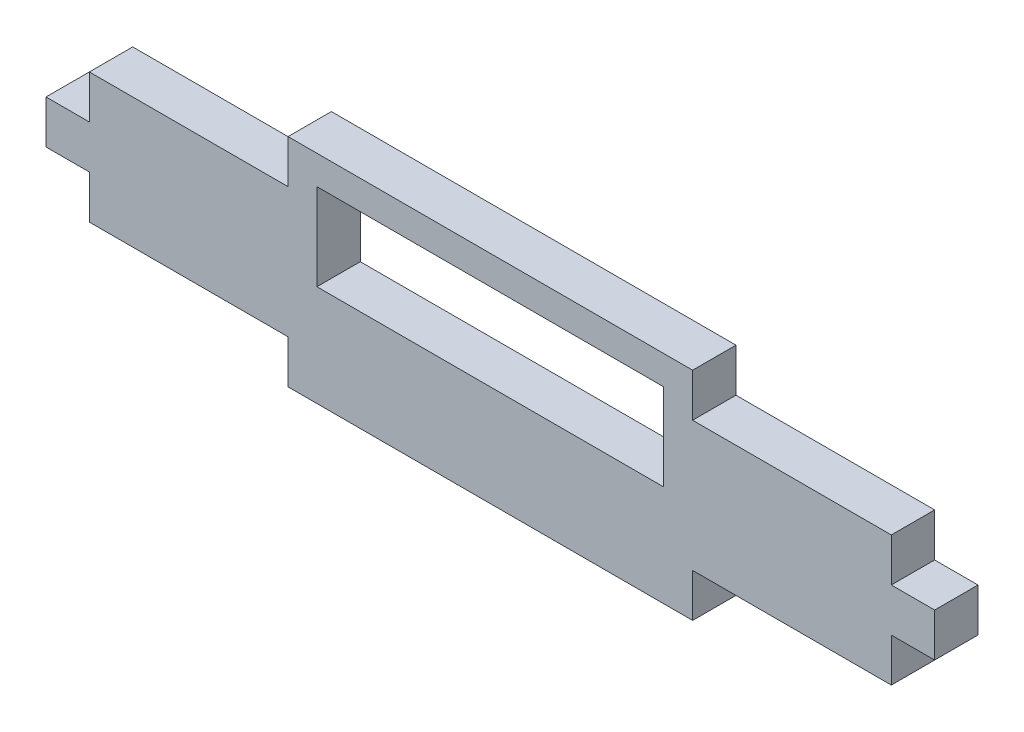
ISO-10303-21;
HEADER;
FILE_DESCRIPTION(('STEP AP214'),'2;1');
FILE_NAME('part.step','',(''),(''),'','','');
FILE_SCHEMA(('AUTOMOTIVE_DESIGN { 1 0 10303 214 1 1 1 1 }'));
ENDSEC;
DATA;
#1=APPLICATION_CONTEXT('core data for automotive mechanical design processes');
#2=APPLICATION_PROTOCOL_DEFINITION('international standard','automotive_design',2000,#1);
#3=PRODUCT_CONTEXT('',#1,'mechanical');
#4=PRODUCT('Part','Part','',(#3));
#5=PRODUCT_RELATED_PRODUCT_CATEGORY('part','',(#4));
#6=PRODUCT_DEFINITION_FORMATION('','',#4);
#7=PRODUCT_DEFINITION_CONTEXT('part definition',#1,'design');
#8=PRODUCT_DEFINITION('design','',#6,#7);
#9=PRODUCT_DEFINITION_SHAPE('','',#8);
#10=(LENGTH_UNIT() NAMED_UNIT(*) SI_UNIT(.MILLI.,.METRE.));
#11=(NAMED_UNIT(*) PLANE_ANGLE_UNIT() SI_UNIT($,.RADIAN.));
#12=(NAMED_UNIT(*) SI_UNIT($,.STERADIAN.) SOLID_ANGLE_UNIT());
#13=UNCERTAINTY_MEASURE_WITH_UNIT(LENGTH_MEASURE(1.E-05),#10,'distance_accuracy_value','');
#14=(GEOMETRIC_REPRESENTATION_CONTEXT(3) GLOBAL_UNCERTAINTY_ASSIGNED_CONTEXT((#13)) GLOBAL_UNIT_ASSIGNED_CONTEXT((#10,
#11,#12)) REPRESENTATION_CONTEXT('',''));
#15=CARTESIAN_POINT('',(0.,0.,0.));
#16=DIRECTION('',(0.,0.,1.));
#17=DIRECTION('',(1.,0.,0.));
#18=AXIS2_PLACEMENT_3D('',#15,#16,#17);
#19=CARTESIAN_POINT('',(0.,0.,3.));
#20=DIRECTION('',(0.,0.,1.));
#21=DIRECTION('',(1.,0.,0.));
#22=AXIS2_PLACEMENT_3D('',#19,#20,#21);
#23=PLANE('',#22);
#24=DIRECTION('',(0.,-1.,0.));
#25=VECTOR('',#24,1.);
#26=CARTESIAN_POINT('',(-14.,-7.5,3.));
#27=LINE('',#26,#25);
#28=CARTESIAN_POINT('',(-14.,-4.5,3.));
#29=VERTEX_POINT('',#28);
#30=CARTESIAN_POINT('',(-14.,-7.5,3.));
#31=VERTEX_POINT('',#30);
#32=EDGE_CURVE('E230',#29,#31,#27,.T.);
#33=ORIENTED_EDGE('',*,*,#32,.T.);
#34=DIRECTION('',(1.,0.,0.));
#35=VECTOR('',#34,1.);
#36=CARTESIAN_POINT('',(-14.,-7.5,3.));
#37=LINE('',#36,#35);
#38=CARTESIAN_POINT('',(14.,-7.5,3.));
#39=VERTEX_POINT('',#38);
#40=EDGE_CURVE('E233',#31,#39,#37,.T.);
#41=ORIENTED_EDGE('',*,*,#40,.T.);
#42=DIRECTION('',(0.,1.,0.));
#43=VECTOR('',#42,1.);
#44=CARTESIAN_POINT('',(14.,-4.5,3.));
#45=LINE('',#44,#43);
#46=CARTESIAN_POINT('',(14.,-4.5,3.));
#47=VERTEX_POINT('',#46);
#48=EDGE_CURVE('E236',#39,#47,#45,.T.);
#49=ORIENTED_EDGE('',*,*,#48,.T.);
#50=DIRECTION('',(1.,0.,0.));
#51=VECTOR('',#50,1.);
#52=CARTESIAN_POINT('',(27.75,-4.5,3.));
#53=LINE('',#52,#51);
#54=CARTESIAN_POINT('',(27.75,-4.5,3.));
#55=VERTEX_POINT('',#54);
#56=EDGE_CURVE('E238',#47,#55,#53,.T.);
#57=ORIENTED_EDGE('',*,*,#56,.T.);
#58=DIRECTION('',(0.,1.,0.));
#59=VECTOR('',#58,1.);
#60=CARTESIAN_POINT('',(27.75,-1.5,3.));
#61=LINE('',#60,#59);
#62=CARTESIAN_POINT('',(27.75,-1.5,3.));
#63=VERTEX_POINT('',#62);
#64=EDGE_CURVE('E240',#55,#63,#61,.T.);
#65=ORIENTED_EDGE('',*,*,#64,.T.);
#66=DIRECTION('',(1.,0.,0.));
#67=VECTOR('',#66,1.);
#68=CARTESIAN_POINT('',(30.75,-1.5,3.));
#69=LINE('',#68,#67);
#70=CARTESIAN_POINT('',(30.75,-1.5,3.));
#71=VERTEX_POINT('',#70);
#72=EDGE_CURVE('E242',#63,#71,#69,.T.);
#73=ORIENTED_EDGE('',*,*,#72,.T.);
#74=DIRECTION('',(0.,1.,0.));
#75=VECTOR('',#74,1.);
#76=CARTESIAN_POINT('',(30.75,-1.5,3.));
#77=LINE('',#76,#75);
#78=CARTESIAN_POINT('',(30.75,1.5,3.));
#79=VERTEX_POINT('',#78);
#80=EDGE_CURVE('E244',#71,#79,#77,.T.);
#81=ORIENTED_EDGE('',*,*,#80,.T.);
#82=DIRECTION('',(-1.,0.,0.));
#83=VECTOR('',#82,1.);
#84=CARTESIAN_POINT('',(30.75,1.5,3.));
#85=LINE('',#84,#83);
#86=CARTESIAN_POINT('',(27.75,1.5,3.));
#87=VERTEX_POINT('',#86);
#88=EDGE_CURVE('E246',#79,#87,#85,.T.);
#89=ORIENTED_EDGE('',*,*,#88,.T.);
#90=DIRECTION('',(0.,1.,0.));
#91=VECTOR('',#90,1.);
#92=CARTESIAN_POINT('',(27.75,1.5,3.));
#93=LINE('',#92,#91);
#94=CARTESIAN_POINT('',(27.75,4.5,3.));
#95=VERTEX_POINT('',#94);
#96=EDGE_CURVE('E248',#87,#95,#93,.T.);
#97=ORIENTED_EDGE('',*,*,#96,.T.);
#98=DIRECTION('',(-1.,0.,0.));
#99=VECTOR('',#98,1.);
#100=CARTESIAN_POINT('',(14.,4.5,3.));
#101=LINE('',#100,#99);
#102=CARTESIAN_POINT('',(14.,4.5,3.));
#103=VERTEX_POINT('',#102);
#104=EDGE_CURVE('E250',#95,#103,#101,.T.);
#105=ORIENTED_EDGE('',*,*,#104,.T.);
#106=DIRECTION('',(0.,1.,0.));
#107=VECTOR('',#106,1.);
#108=CARTESIAN_POINT('',(14.,7.5,3.));
#109=LINE('',#108,#107);
#110=CARTESIAN_POINT('',(14.,7.5,3.));
#111=VERTEX_POINT('',#110);
#112=EDGE_CURVE('E252',#103,#111,#109,.T.);
#113=ORIENTED_EDGE('',*,*,#112,.T.);
#114=DIRECTION('',(-1.,0.,0.));
#115=VECTOR('',#114,1.);
#116=CARTESIAN_POINT('',(14.,7.5,3.));
#117=LINE('',#116,#115);
#118=CARTESIAN_POINT('',(-14.,7.5,3.));
#119=VERTEX_POINT('',#118);
#120=EDGE_CURVE('E254',#111,#119,#117,.T.);
#121=ORIENTED_EDGE('',*,*,#120,.T.);
#122=DIRECTION('',(0.,-1.,0.));
#123=VECTOR('',#122,1.);
#124=CARTESIAN_POINT('',(-14.,7.5,3.));
#125=LINE('',#124,#123);
#126=CARTESIAN_POINT('',(-14.,4.5,3.));
#127=VERTEX_POINT('',#126);
#128=EDGE_CURVE('E256',#119,#127,#125,.T.);
#129=ORIENTED_EDGE('',*,*,#128,.T.);
#130=DIRECTION('',(-1.,0.,0.));
#131=VECTOR('',#130,1.);
#132=CARTESIAN_POINT('',(-27.75,4.5,3.));
#133=LINE('',#132,#131);
#134=CARTESIAN_POINT('',(-27.75,4.5,3.));
#135=VERTEX_POINT('',#134);
#136=EDGE_CURVE('E258',#127,#135,#133,.T.);
#137=ORIENTED_EDGE('',*,*,#136,.T.);
#138=DIRECTION('',(0.,-1.,0.));
#139=VECTOR('',#138,1.);
#140=CARTESIAN_POINT('',(-27.75,1.5,3.));
#141=LINE('',#140,#139);
#142=CARTESIAN_POINT('',(-27.75,1.5,3.));
#143=VERTEX_POINT('',#142);
#144=EDGE_CURVE('E260',#135,#143,#141,.T.);
#145=ORIENTED_EDGE('',*,*,#144,.T.);
#146=DIRECTION('',(-1.,0.,0.));
#147=VECTOR('',#146,1.);
#148=CARTESIAN_POINT('',(-30.75,1.5,3.));
#149=LINE('',#148,#147);
#150=CARTESIAN_POINT('',(-30.75,1.5,3.));
#151=VERTEX_POINT('',#150);
#152=EDGE_CURVE('E262',#143,#151,#149,.T.);
#153=ORIENTED_EDGE('',*,*,#152,.T.);
#154=DIRECTION('',(0.,-1.,0.));
#155=VECTOR('',#154,1.);
#156=CARTESIAN_POINT('',(-30.75,1.5,3.));
#157=LINE('',#156,#155);
#158=CARTESIAN_POINT('',(-30.75,-1.5,3.));
#159=VERTEX_POINT('',#158);
#160=EDGE_CURVE('E264',#151,#159,#157,.T.);
#161=ORIENTED_EDGE('',*,*,#160,.T.);
#162=DIRECTION('',(1.,0.,0.));
#163=VECTOR('',#162,1.);
#164=CARTESIAN_POINT('',(-30.75,-1.5,3.));
#165=LINE('',#164,#163);
#166=CARTESIAN_POINT('',(-27.75,-1.5,3.));
#167=VERTEX_POINT('',#166);
#168=EDGE_CURVE('E266',#159,#167,#165,.T.);
#169=ORIENTED_EDGE('',*,*,#168,.T.);
#170=DIRECTION('',(0.,-1.,0.));
#171=VECTOR('',#170,1.);
#172=CARTESIAN_POINT('',(-27.75,-1.5,3.));
#173=LINE('',#172,#171);
#174=CARTESIAN_POINT('',(-27.75,-4.5,3.));
#175=VERTEX_POINT('',#174);
#176=EDGE_CURVE('E268',#167,#175,#173,.T.);
#177=ORIENTED_EDGE('',*,*,#176,.T.);
#178=DIRECTION('',(1.,0.,0.));
#179=VECTOR('',#178,1.);
#180=CARTESIAN_POINT('',(-14.,-4.5,3.));
#181=LINE('',#180,#179);
#182=EDGE_CURVE('E270',#175,#29,#181,.T.);
#183=ORIENTED_EDGE('',*,*,#182,.T.);
#184=EDGE_LOOP('',(#33,#41,#49,#57,#65,#73,#81,#89,#97,#105,#113,#121,#129,#137,#145,#153,#161,
#169,#177,#183));
#185=FACE_BOUND('',#184,.T.);
#186=DIRECTION('',(-1.,0.,0.));
#187=VECTOR('',#186,1.);
#188=CARTESIAN_POINT('',(-12.,5.5,3.));
#189=LINE('',#188,#187);
#190=CARTESIAN_POINT('',(12.,5.5,3.));
#191=VERTEX_POINT('',#190);
#192=CARTESIAN_POINT('',(-12.,5.5,3.));
#193=VERTEX_POINT('',#192);
#194=EDGE_CURVE('E202',#191,#193,#189,.T.);
#195=ORIENTED_EDGE('',*,*,#194,.F.);
#196=DIRECTION('',(0.,1.,0.));
#197=VECTOR('',#196,1.);
#198=CARTESIAN_POINT('',(12.,-0.5,3.));
#199=LINE('',#198,#197);
#200=CARTESIAN_POINT('',(12.,-0.5,3.));
#201=VERTEX_POINT('',#200);
#202=EDGE_CURVE('E194',#201,#191,#199,.T.);
#203=ORIENTED_EDGE('',*,*,#202,.F.);
#204=DIRECTION('',(1.,0.,0.));
#205=VECTOR('',#204,1.);
#206=CARTESIAN_POINT('',(-12.,-0.5,3.));
#207=LINE('',#206,#205);
#208=CARTESIAN_POINT('',(-12.,-0.5,3.));
#209=VERTEX_POINT('',#208);
#210=EDGE_CURVE('E216',#209,#201,#207,.T.);
#211=ORIENTED_EDGE('',*,*,#210,.F.);
#212=DIRECTION('',(0.,-1.,0.));
#213=VECTOR('',#212,1.);
#214=CARTESIAN_POINT('',(-12.,-0.5,3.));
#215=LINE('',#214,#213);
#216=EDGE_CURVE('E214',#193,#209,#215,.T.);
#217=ORIENTED_EDGE('',*,*,#216,.F.);
#218=EDGE_LOOP('',(#195,#203,#211,#217));
#219=FACE_BOUND('',#218,.T.);
#220=ADVANCED_FACE('F33',(#185,#219),#23,.T.);
#221=CARTESIAN_POINT('',(0.,0.,0.));
#222=DIRECTION('',(0.,0.,1.));
#223=DIRECTION('',(1.,0.,0.));
#224=AXIS2_PLACEMENT_3D('',#221,#222,#223);
#225=PLANE('',#224);
#226=DIRECTION('',(0.,-1.,0.));
#227=VECTOR('',#226,1.);
#228=CARTESIAN_POINT('',(-14.,-7.5,0.));
#229=LINE('',#228,#227);
#230=CARTESIAN_POINT('',(-14.,-4.5,0.));
#231=VERTEX_POINT('',#230);
#232=CARTESIAN_POINT('',(-14.,-7.5,0.));
#233=VERTEX_POINT('',#232);
#234=EDGE_CURVE('E210',#231,#233,#229,.T.);
#235=ORIENTED_EDGE('',*,*,#234,.F.);
#236=DIRECTION('',(1.,0.,0.));
#237=VECTOR('',#236,1.);
#238=CARTESIAN_POINT('',(-14.,-4.5,0.));
#239=LINE('',#238,#237);
#240=CARTESIAN_POINT('',(-27.75,-4.5,0.));
#241=VERTEX_POINT('',#240);
#242=EDGE_CURVE('E234',#241,#231,#239,.T.);
#243=ORIENTED_EDGE('',*,*,#242,.F.);
#244=DIRECTION('',(0.,-1.,0.));
#245=VECTOR('',#244,1.);
#246=CARTESIAN_POINT('',(-27.75,-1.5,0.));
#247=LINE('',#246,#245);
#248=CARTESIAN_POINT('',(-27.75,-1.5,0.));
#249=VERTEX_POINT('',#248);
#250=EDGE_CURVE('E309',#249,#241,#247,.T.);
#251=ORIENTED_EDGE('',*,*,#250,.F.);
#252=DIRECTION('',(1.,0.,0.));
#253=VECTOR('',#252,1.);
#254=CARTESIAN_POINT('',(-30.75,-1.5,0.));
#255=LINE('',#254,#253);
#256=CARTESIAN_POINT('',(-30.75,-1.5,0.));
#257=VERTEX_POINT('',#256);
#258=EDGE_CURVE('E307',#257,#249,#255,.T.);
#259=ORIENTED_EDGE('',*,*,#258,.F.);
#260=DIRECTION('',(0.,-1.,0.));
#261=VECTOR('',#260,1.);
#262=CARTESIAN_POINT('',(-30.75,1.5,0.));
#263=LINE('',#262,#261);
#264=CARTESIAN_POINT('',(-30.75,1.5,0.));
#265=VERTEX_POINT('',#264);
#266=EDGE_CURVE('E305',#265,#257,#263,.T.);
#267=ORIENTED_EDGE('',*,*,#266,.F.);
#268=DIRECTION('',(-1.,0.,0.));
#269=VECTOR('',#268,1.);
#270=CARTESIAN_POINT('',(-30.75,1.5,0.));
#271=LINE('',#270,#269);
#272=CARTESIAN_POINT('',(-27.75,1.5,0.));
#273=VERTEX_POINT('',#272);
#274=EDGE_CURVE('E303',#273,#265,#271,.T.);
#275=ORIENTED_EDGE('',*,*,#274,.F.);
#276=DIRECTION('',(0.,-1.,0.));
#277=VECTOR('',#276,1.);
#278=CARTESIAN_POINT('',(-27.75,1.5,0.));
#279=LINE('',#278,#277);
#280=CARTESIAN_POINT('',(-27.75,4.5,0.));
#281=VERTEX_POINT('',#280);
#282=EDGE_CURVE('E301',#281,#273,#279,.T.);
#283=ORIENTED_EDGE('',*,*,#282,.F.);
#284=DIRECTION('',(-1.,0.,0.));
#285=VECTOR('',#284,1.);
#286=CARTESIAN_POINT('',(-27.75,4.5,0.));
#287=LINE('',#286,#285);
#288=CARTESIAN_POINT('',(-14.,4.5,0.));
#289=VERTEX_POINT('',#288);
#290=EDGE_CURVE('E299',#289,#281,#287,.T.);
#291=ORIENTED_EDGE('',*,*,#290,.F.);
#292=DIRECTION('',(0.,-1.,0.));
#293=VECTOR('',#292,1.);
#294=CARTESIAN_POINT('',(-14.,7.5,0.));
#295=LINE('',#294,#293);
#296=CARTESIAN_POINT('',(-14.,7.5,0.));
#297=VERTEX_POINT('',#296);
#298=EDGE_CURVE('E297',#297,#289,#295,.T.);
#299=ORIENTED_EDGE('',*,*,#298,.F.);
#300=DIRECTION('',(-1.,0.,0.));
#301=VECTOR('',#300,1.);
#302=CARTESIAN_POINT('',(14.,7.5,0.));
#303=LINE('',#302,#301);
#304=CARTESIAN_POINT('',(14.,7.5,0.));
#305=VERTEX_POINT('',#304);
#306=EDGE_CURVE('E295',#305,#297,#303,.T.);
#307=ORIENTED_EDGE('',*,*,#306,.F.);
#308=DIRECTION('',(0.,1.,0.));
#309=VECTOR('',#308,1.);
#310=CARTESIAN_POINT('',(14.,7.5,0.));
#311=LINE('',#310,#309);
#312=CARTESIAN_POINT('',(14.,4.5,0.));
#313=VERTEX_POINT('',#312);
#314=EDGE_CURVE('E293',#313,#305,#311,.T.);
#315=ORIENTED_EDGE('',*,*,#314,.F.);
#316=DIRECTION('',(-1.,0.,0.));
#317=VECTOR('',#316,1.);
#318=CARTESIAN_POINT('',(14.,4.5,0.));
#319=LINE('',#318,#317);
#320=CARTESIAN_POINT('',(27.75,4.5,0.));
#321=VERTEX_POINT('',#320);
#322=EDGE_CURVE('E291',#321,#313,#319,.T.);
#323=ORIENTED_EDGE('',*,*,#322,.F.);
#324=DIRECTION('',(0.,1.,0.));
#325=VECTOR('',#324,1.);
#326=CARTESIAN_POINT('',(27.75,1.5,0.));
#327=LINE('',#326,#325);
#328=CARTESIAN_POINT('',(27.75,1.5,0.));
#329=VERTEX_POINT('',#328);
#330=EDGE_CURVE('E289',#329,#321,#327,.T.);
#331=ORIENTED_EDGE('',*,*,#330,.F.);
#332=DIRECTION('',(-1.,0.,0.));
#333=VECTOR('',#332,1.);
#334=CARTESIAN_POINT('',(30.75,1.5,0.));
#335=LINE('',#334,#333);
#336=CARTESIAN_POINT('',(30.75,1.5,0.));
#337=VERTEX_POINT('',#336);
#338=EDGE_CURVE('E287',#337,#329,#335,.T.);
#339=ORIENTED_EDGE('',*,*,#338,.F.);
#340=DIRECTION('',(0.,1.,0.));
#341=VECTOR('',#340,1.);
#342=CARTESIAN_POINT('',(30.75,-1.5,0.));
#343=LINE('',#342,#341);
#344=CARTESIAN_POINT('',(30.75,-1.5,0.));
#345=VERTEX_POINT('',#344);
#346=EDGE_CURVE('E285',#345,#337,#343,.T.);
#347=ORIENTED_EDGE('',*,*,#346,.F.);
#348=DIRECTION('',(1.,0.,0.));
#349=VECTOR('',#348,1.);
#350=CARTESIAN_POINT('',(30.75,-1.5,0.));
#351=LINE('',#350,#349);
#352=CARTESIAN_POINT('',(27.75,-1.5,0.));
#353=VERTEX_POINT('',#352);
#354=EDGE_CURVE('E283',#353,#345,#351,.T.);
#355=ORIENTED_EDGE('',*,*,#354,.F.);
#356=DIRECTION('',(0.,1.,0.));
#357=VECTOR('',#356,1.);
#358=CARTESIAN_POINT('',(27.75,-1.5,0.));
#359=LINE('',#358,#357);
#360=CARTESIAN_POINT('',(27.75,-4.5,0.));
#361=VERTEX_POINT('',#360);
#362=EDGE_CURVE('E281',#361,#353,#359,.T.);
#363=ORIENTED_EDGE('',*,*,#362,.F.);
#364=DIRECTION('',(1.,0.,0.));
#365=VECTOR('',#364,1.);
#366=CARTESIAN_POINT('',(27.75,-4.5,0.));
#367=LINE('',#366,#365);
#368=CARTESIAN_POINT('',(14.,-4.5,0.));
#369=VERTEX_POINT('',#368);
#370=EDGE_CURVE('E279',#369,#361,#367,.T.);
#371=ORIENTED_EDGE('',*,*,#370,.F.);
#372=DIRECTION('',(0.,1.,0.));
#373=VECTOR('',#372,1.);
#374=CARTESIAN_POINT('',(14.,-4.5,0.));
#375=LINE('',#374,#373);
#376=CARTESIAN_POINT('',(14.,-7.5,0.));
#377=VERTEX_POINT('',#376);
#378=EDGE_CURVE('E277',#377,#369,#375,.T.);
#379=ORIENTED_EDGE('',*,*,#378,.F.);
#380=DIRECTION('',(1.,0.,0.));
#381=VECTOR('',#380,1.);
#382=CARTESIAN_POINT('',(-14.,-7.5,0.));
#383=LINE('',#382,#381);
#384=EDGE_CURVE('E275',#233,#377,#383,.T.);
#385=ORIENTED_EDGE('',*,*,#384,.F.);
#386=EDGE_LOOP('',(#235,#243,#251,#259,#267,#275,#283,#291,#299,#307,#315,#323,#331,#339,#347,
#355,#363,#371,#379,#385));
#387=FACE_BOUND('',#386,.T.);
#388=DIRECTION('',(0.,1.,0.));
#389=VECTOR('',#388,1.);
#390=CARTESIAN_POINT('',(12.,-0.5,0.));
#391=LINE('',#390,#389);
#392=CARTESIAN_POINT('',(12.,-0.5,0.));
#393=VERTEX_POINT('',#392);
#394=CARTESIAN_POINT('',(12.,5.5,0.));
#395=VERTEX_POINT('',#394);
#396=EDGE_CURVE('E56',#393,#395,#391,.T.);
#397=ORIENTED_EDGE('',*,*,#396,.T.);
#398=DIRECTION('',(-1.,0.,0.));
#399=VECTOR('',#398,1.);
#400=CARTESIAN_POINT('',(-12.,5.5,0.));
#401=LINE('',#400,#399);
#402=CARTESIAN_POINT('',(-12.,5.5,0.));
#403=VERTEX_POINT('',#402);
#404=EDGE_CURVE('E209',#395,#403,#401,.T.);
#405=ORIENTED_EDGE('',*,*,#404,.T.);
#406=DIRECTION('',(0.,-1.,0.));
#407=VECTOR('',#406,1.);
#408=CARTESIAN_POINT('',(-12.,-0.5,0.));
#409=LINE('',#408,#407);
#410=CARTESIAN_POINT('',(-12.,-0.5,0.));
#411=VERTEX_POINT('',#410);
#412=EDGE_CURVE('E222',#403,#411,#409,.T.);
#413=ORIENTED_EDGE('',*,*,#412,.T.);
#414=DIRECTION('',(1.,0.,0.));
#415=VECTOR('',#414,1.);
#416=CARTESIAN_POINT('',(-12.,-0.5,0.));
#417=LINE('',#416,#415);
#418=EDGE_CURVE('E203',#411,#393,#417,.T.);
#419=ORIENTED_EDGE('',*,*,#418,.T.);
#420=EDGE_LOOP('',(#397,#405,#413,#419));
#421=FACE_BOUND('',#420,.T.);
#422=ADVANCED_FACE('F375',(#387,#421),#225,.F.);
#423=CARTESIAN_POINT('',(-14.,-7.5,3.));
#424=DIRECTION('',(1.,0.,0.));
#425=DIRECTION('',(0.,0.,-1.));
#426=AXIS2_PLACEMENT_3D('',#423,#424,#425);
#427=PLANE('',#426);
#428=ORIENTED_EDGE('',*,*,#234,.T.);
#429=DIRECTION('',(0.,0.,-1.));
#430=VECTOR('',#429,1.);
#431=CARTESIAN_POINT('',(-14.,-7.5,3.));
#432=LINE('',#431,#430);
#433=EDGE_CURVE('E11',#31,#233,#432,.T.);
#434=ORIENTED_EDGE('',*,*,#433,.F.);
#435=ORIENTED_EDGE('',*,*,#32,.F.);
#436=DIRECTION('',(0.,0.,-1.));
#437=VECTOR('',#436,1.);
#438=CARTESIAN_POINT('',(-14.,-4.5,3.));
#439=LINE('',#438,#437);
#440=EDGE_CURVE('E272',#29,#231,#439,.T.);
#441=ORIENTED_EDGE('',*,*,#440,.T.);
#442=EDGE_LOOP('',(#428,#434,#435,#441));
#443=FACE_BOUND('',#442,.T.);
#444=ADVANCED_FACE('F35',(#443),#427,.F.);
#445=CARTESIAN_POINT('',(-14.,-7.5,3.));
#446=DIRECTION('',(0.,1.,0.));
#447=DIRECTION('',(0.,0.,1.));
#448=AXIS2_PLACEMENT_3D('',#445,#446,#447);
#449=PLANE('',#448);
#450=ORIENTED_EDGE('',*,*,#384,.T.);
#451=DIRECTION('',(0.,0.,-1.));
#452=VECTOR('',#451,1.);
#453=CARTESIAN_POINT('',(14.,-7.5,3.));
#454=LINE('',#453,#452);
#455=EDGE_CURVE('E41',#39,#377,#454,.T.);
#456=ORIENTED_EDGE('',*,*,#455,.F.);
#457=ORIENTED_EDGE('',*,*,#40,.F.);
#458=ORIENTED_EDGE('',*,*,#433,.T.);
#459=EDGE_LOOP('',(#450,#456,#457,#458));
#460=FACE_BOUND('',#459,.T.);
#461=ADVANCED_FACE('F392',(#460),#449,.F.);
#462=CARTESIAN_POINT('',(14.,-4.5,3.));
#463=DIRECTION('',(-1.,0.,0.));
#464=DIRECTION('',(0.,0.,1.));
#465=AXIS2_PLACEMENT_3D('',#462,#463,#464);
#466=PLANE('',#465);
#467=ORIENTED_EDGE('',*,*,#378,.T.);
#468=DIRECTION('',(0.,0.,-1.));
#469=VECTOR('',#468,1.);
#470=CARTESIAN_POINT('',(14.,-4.5,3.));
#471=LINE('',#470,#469);
#472=EDGE_CURVE('E362',#47,#369,#471,.T.);
#473=ORIENTED_EDGE('',*,*,#472,.F.);
#474=ORIENTED_EDGE('',*,*,#48,.F.);
#475=ORIENTED_EDGE('',*,*,#455,.T.);
#476=EDGE_LOOP('',(#467,#473,#474,#475));
#477=FACE_BOUND('',#476,.T.);
#478=ADVANCED_FACE('F369',(#477),#466,.F.);
#479=CARTESIAN_POINT('',(27.75,-4.5,3.));
#480=DIRECTION('',(0.,1.,0.));
#481=DIRECTION('',(-1.,0.,0.));
#482=AXIS2_PLACEMENT_3D('',#479,#480,#481);
#483=PLANE('',#482);
#484=ORIENTED_EDGE('',*,*,#370,.T.);
#485=DIRECTION('',(0.,0.,-1.));
#486=VECTOR('',#485,1.);
#487=CARTESIAN_POINT('',(27.75,-4.5,3.));
#488=LINE('',#487,#486);
#489=EDGE_CURVE('E359',#55,#361,#488,.T.);
#490=ORIENTED_EDGE('',*,*,#489,.F.);
#491=ORIENTED_EDGE('',*,*,#56,.F.);
#492=ORIENTED_EDGE('',*,*,#472,.T.);
#493=EDGE_LOOP('',(#484,#490,#491,#492));
#494=FACE_BOUND('',#493,.T.);
#495=ADVANCED_FACE('F381',(#494),#483,.F.);
#496=CARTESIAN_POINT('',(27.75,-1.5,3.));
#497=DIRECTION('',(-1.,0.,0.));
#498=DIRECTION('',(0.,0.,1.));
#499=AXIS2_PLACEMENT_3D('',#496,#497,#498);
#500=PLANE('',#499);
#501=ORIENTED_EDGE('',*,*,#362,.T.);
#502=DIRECTION('',(0.,0.,-1.));
#503=VECTOR('',#502,1.);
#504=CARTESIAN_POINT('',(27.75,-1.5,3.));
#505=LINE('',#504,#503);
#506=EDGE_CURVE('E356',#63,#353,#505,.T.);
#507=ORIENTED_EDGE('',*,*,#506,.F.);
#508=ORIENTED_EDGE('',*,*,#64,.F.);
#509=ORIENTED_EDGE('',*,*,#489,.T.);
#510=EDGE_LOOP('',(#501,#507,#508,#509));
#511=FACE_BOUND('',#510,.T.);
#512=ADVANCED_FACE('F385',(#511),#500,.F.);
#513=CARTESIAN_POINT('',(30.75,-1.5,3.));
#514=DIRECTION('',(0.,1.,0.));
#515=DIRECTION('',(-1.,0.,0.));
#516=AXIS2_PLACEMENT_3D('',#513,#514,#515);
#517=PLANE('',#516);
#518=ORIENTED_EDGE('',*,*,#354,.T.);
#519=DIRECTION('',(0.,0.,-1.));
#520=VECTOR('',#519,1.);
#521=CARTESIAN_POINT('',(30.75,-1.5,3.));
#522=LINE('',#521,#520);
#523=EDGE_CURVE('E353',#71,#345,#522,.T.);
#524=ORIENTED_EDGE('',*,*,#523,.F.);
#525=ORIENTED_EDGE('',*,*,#72,.F.);
#526=ORIENTED_EDGE('',*,*,#506,.T.);
#527=EDGE_LOOP('',(#518,#524,#525,#526));
#528=FACE_BOUND('',#527,.T.);
#529=ADVANCED_FACE('F465',(#528),#517,.F.);
#530=CARTESIAN_POINT('',(30.75,-1.5,3.));
#531=DIRECTION('',(-1.,0.,0.));
#532=DIRECTION('',(0.,0.,1.));
#533=AXIS2_PLACEMENT_3D('',#530,#531,#532);
#534=PLANE('',#533);
#535=ORIENTED_EDGE('',*,*,#346,.T.);
#536=DIRECTION('',(0.,0.,-1.));
#537=VECTOR('',#536,1.);
#538=CARTESIAN_POINT('',(30.75,1.5,3.));
#539=LINE('',#538,#537);
#540=EDGE_CURVE('E350',#79,#337,#539,.T.);
#541=ORIENTED_EDGE('',*,*,#540,.F.);
#542=ORIENTED_EDGE('',*,*,#80,.F.);
#543=ORIENTED_EDGE('',*,*,#523,.T.);
#544=EDGE_LOOP('',(#535,#541,#542,#543));
#545=FACE_BOUND('',#544,.T.);
#546=ADVANCED_FACE('F463',(#545),#534,.F.);
#547=CARTESIAN_POINT('',(30.75,1.5,3.));
#548=DIRECTION('',(0.,-1.,0.));
#549=DIRECTION('',(1.,0.,0.));
#550=AXIS2_PLACEMENT_3D('',#547,#548,#549);
#551=PLANE('',#550);
#552=ORIENTED_EDGE('',*,*,#338,.T.);
#553=DIRECTION('',(0.,0.,-1.));
#554=VECTOR('',#553,1.);
#555=CARTESIAN_POINT('',(27.75,1.5,3.));
#556=LINE('',#555,#554);
#557=EDGE_CURVE('E347',#87,#329,#556,.T.);
#558=ORIENTED_EDGE('',*,*,#557,.F.);
#559=ORIENTED_EDGE('',*,*,#88,.F.);
#560=ORIENTED_EDGE('',*,*,#540,.T.);
#561=EDGE_LOOP('',(#552,#558,#559,#560));
#562=FACE_BOUND('',#561,.T.);
#563=ADVANCED_FACE('F458',(#562),#551,.F.);
#564=CARTESIAN_POINT('',(27.75,1.5,3.));
#565=DIRECTION('',(-1.,0.,0.));
#566=DIRECTION('',(0.,0.,1.));
#567=AXIS2_PLACEMENT_3D('',#564,#565,#566);
#568=PLANE('',#567);
#569=ORIENTED_EDGE('',*,*,#330,.T.);
#570=DIRECTION('',(0.,0.,-1.));
#571=VECTOR('',#570,1.);
#572=CARTESIAN_POINT('',(27.75,4.5,3.));
#573=LINE('',#572,#571);
#574=EDGE_CURVE('E344',#95,#321,#573,.T.);
#575=ORIENTED_EDGE('',*,*,#574,.F.);
#576=ORIENTED_EDGE('',*,*,#96,.F.);
#577=ORIENTED_EDGE('',*,*,#557,.T.);
#578=EDGE_LOOP('',(#569,#575,#576,#577));
#579=FACE_BOUND('',#578,.T.);
#580=ADVANCED_FACE('F453',(#579),#568,.F.);
#581=CARTESIAN_POINT('',(14.,4.5,3.));
#582=DIRECTION('',(0.,-1.,0.));
#583=DIRECTION('',(1.,0.,0.));
#584=AXIS2_PLACEMENT_3D('',#581,#582,#583);
#585=PLANE('',#584);
#586=ORIENTED_EDGE('',*,*,#322,.T.);
#587=DIRECTION('',(0.,0.,-1.));
#588=VECTOR('',#587,1.);
#589=CARTESIAN_POINT('',(14.,4.5,3.));
#590=LINE('',#589,#588);
#591=EDGE_CURVE('E341',#103,#313,#590,.T.);
#592=ORIENTED_EDGE('',*,*,#591,.F.);
#593=ORIENTED_EDGE('',*,*,#104,.F.);
#594=ORIENTED_EDGE('',*,*,#574,.T.);
#595=EDGE_LOOP('',(#586,#592,#593,#594));
#596=FACE_BOUND('',#595,.T.);
#597=ADVANCED_FACE('F449',(#596),#585,.F.);
#598=CARTESIAN_POINT('',(14.,7.5,3.));
#599=DIRECTION('',(-1.,0.,0.));
#600=DIRECTION('',(0.,0.,1.));
#601=AXIS2_PLACEMENT_3D('',#598,#599,#600);
#602=PLANE('',#601);
#603=ORIENTED_EDGE('',*,*,#314,.T.);
#604=DIRECTION('',(0.,0.,-1.));
#605=VECTOR('',#604,1.);
#606=CARTESIAN_POINT('',(14.,7.5,3.));
#607=LINE('',#606,#605);
#608=EDGE_CURVE('E338',#111,#305,#607,.T.);
#609=ORIENTED_EDGE('',*,*,#608,.F.);
#610=ORIENTED_EDGE('',*,*,#112,.F.);
#611=ORIENTED_EDGE('',*,*,#591,.T.);
#612=EDGE_LOOP('',(#603,#609,#610,#611));
#613=FACE_BOUND('',#612,.T.);
#614=ADVANCED_FACE('F444',(#613),#602,.F.);
#615=CARTESIAN_POINT('',(14.,7.5,3.));
#616=DIRECTION('',(0.,-1.,0.));
#617=DIRECTION('',(0.,0.,-1.));
#618=AXIS2_PLACEMENT_3D('',#615,#616,#617);
#619=PLANE('',#618);
#620=ORIENTED_EDGE('',*,*,#306,.T.);
#621=DIRECTION('',(0.,0.,-1.));
#622=VECTOR('',#621,1.);
#623=CARTESIAN_POINT('',(-14.,7.5,3.));
#624=LINE('',#623,#622);
#625=EDGE_CURVE('E335',#119,#297,#624,.T.);
#626=ORIENTED_EDGE('',*,*,#625,.F.);
#627=ORIENTED_EDGE('',*,*,#120,.F.);
#628=ORIENTED_EDGE('',*,*,#608,.T.);
#629=EDGE_LOOP('',(#620,#626,#627,#628));
#630=FACE_BOUND('',#629,.T.);
#631=ADVANCED_FACE('F438',(#630),#619,.F.);
#632=CARTESIAN_POINT('',(-14.,7.5,3.));
#633=DIRECTION('',(1.,0.,0.));
#634=DIRECTION('',(0.,0.,-1.));
#635=AXIS2_PLACEMENT_3D('',#632,#633,#634);
#636=PLANE('',#635);
#637=ORIENTED_EDGE('',*,*,#298,.T.);
#638=DIRECTION('',(0.,0.,-1.));
#639=VECTOR('',#638,1.);
#640=CARTESIAN_POINT('',(-14.,4.5,3.));
#641=LINE('',#640,#639);
#642=EDGE_CURVE('E332',#127,#289,#641,.T.);
#643=ORIENTED_EDGE('',*,*,#642,.F.);
#644=ORIENTED_EDGE('',*,*,#128,.F.);
#645=ORIENTED_EDGE('',*,*,#625,.T.);
#646=EDGE_LOOP('',(#637,#643,#644,#645));
#647=FACE_BOUND('',#646,.T.);
#648=ADVANCED_FACE('F434',(#647),#636,.F.);
#649=CARTESIAN_POINT('',(-27.75,4.5,3.));
#650=DIRECTION('',(0.,-1.,0.));
#651=DIRECTION('',(1.,0.,0.));
#652=AXIS2_PLACEMENT_3D('',#649,#650,#651);
#653=PLANE('',#652);
#654=ORIENTED_EDGE('',*,*,#290,.T.);
#655=DIRECTION('',(0.,0.,-1.));
#656=VECTOR('',#655,1.);
#657=CARTESIAN_POINT('',(-27.75,4.5,3.));
#658=LINE('',#657,#656);
#659=EDGE_CURVE('E329',#135,#281,#658,.T.);
#660=ORIENTED_EDGE('',*,*,#659,.F.);
#661=ORIENTED_EDGE('',*,*,#136,.F.);
#662=ORIENTED_EDGE('',*,*,#642,.T.);
#663=EDGE_LOOP('',(#654,#660,#661,#662));
#664=FACE_BOUND('',#663,.T.);
#665=ADVANCED_FACE('F429',(#664),#653,.F.);
#666=CARTESIAN_POINT('',(-27.75,1.5,3.));
#667=DIRECTION('',(1.,0.,0.));
#668=DIRECTION('',(0.,0.,-1.));
#669=AXIS2_PLACEMENT_3D('',#666,#667,#668);
#670=PLANE('',#669);
#671=ORIENTED_EDGE('',*,*,#282,.T.);
#672=DIRECTION('',(0.,0.,-1.));
#673=VECTOR('',#672,1.);
#674=CARTESIAN_POINT('',(-27.75,1.5,3.));
#675=LINE('',#674,#673);
#676=EDGE_CURVE('E326',#143,#273,#675,.T.);
#677=ORIENTED_EDGE('',*,*,#676,.F.);
#678=ORIENTED_EDGE('',*,*,#144,.F.);
#679=ORIENTED_EDGE('',*,*,#659,.T.);
#680=EDGE_LOOP('',(#671,#677,#678,#679));
#681=FACE_BOUND('',#680,.T.);
#682=ADVANCED_FACE('F423',(#681),#670,.F.);
#683=CARTESIAN_POINT('',(-30.75,1.5,3.));
#684=DIRECTION('',(0.,-1.,0.));
#685=DIRECTION('',(0.,0.,-1.));
#686=AXIS2_PLACEMENT_3D('',#683,#684,#685);
#687=PLANE('',#686);
#688=ORIENTED_EDGE('',*,*,#274,.T.);
#689=DIRECTION('',(0.,0.,-1.));
#690=VECTOR('',#689,1.);
#691=CARTESIAN_POINT('',(-30.75,1.5,3.));
#692=LINE('',#691,#690);
#693=EDGE_CURVE('E323',#151,#265,#692,.T.);
#694=ORIENTED_EDGE('',*,*,#693,.F.);
#695=ORIENTED_EDGE('',*,*,#152,.F.);
#696=ORIENTED_EDGE('',*,*,#676,.T.);
#697=EDGE_LOOP('',(#688,#694,#695,#696));
#698=FACE_BOUND('',#697,.T.);
#699=ADVANCED_FACE('F419',(#698),#687,.F.);
#700=CARTESIAN_POINT('',(-30.75,1.5,3.));
#701=DIRECTION('',(1.,0.,0.));
#702=DIRECTION('',(0.,0.,-1.));
#703=AXIS2_PLACEMENT_3D('',#700,#701,#702);
#704=PLANE('',#703);
#705=ORIENTED_EDGE('',*,*,#266,.T.);
#706=DIRECTION('',(0.,0.,-1.));
#707=VECTOR('',#706,1.);
#708=CARTESIAN_POINT('',(-30.75,-1.5,3.));
#709=LINE('',#708,#707);
#710=EDGE_CURVE('E320',#159,#257,#709,.T.);
#711=ORIENTED_EDGE('',*,*,#710,.F.);
#712=ORIENTED_EDGE('',*,*,#160,.F.);
#713=ORIENTED_EDGE('',*,*,#693,.T.);
#714=EDGE_LOOP('',(#705,#711,#712,#713));
#715=FACE_BOUND('',#714,.T.);
#716=ADVANCED_FACE('F414',(#715),#704,.F.);
#717=CARTESIAN_POINT('',(-30.75,-1.5,3.));
#718=DIRECTION('',(0.,1.,0.));
#719=DIRECTION('',(0.,0.,1.));
#720=AXIS2_PLACEMENT_3D('',#717,#718,#719);
#721=PLANE('',#720);
#722=ORIENTED_EDGE('',*,*,#258,.T.);
#723=DIRECTION('',(0.,0.,-1.));
#724=VECTOR('',#723,1.);
#725=CARTESIAN_POINT('',(-27.75,-1.5,3.));
#726=LINE('',#725,#724);
#727=EDGE_CURVE('E317',#167,#249,#726,.T.);
#728=ORIENTED_EDGE('',*,*,#727,.F.);
#729=ORIENTED_EDGE('',*,*,#168,.F.);
#730=ORIENTED_EDGE('',*,*,#710,.T.);
#731=EDGE_LOOP('',(#722,#728,#729,#730));
#732=FACE_BOUND('',#731,.T.);
#733=ADVANCED_FACE('F408',(#732),#721,.F.);
#734=CARTESIAN_POINT('',(-27.75,-1.5,3.));
#735=DIRECTION('',(1.,0.,0.));
#736=DIRECTION('',(0.,0.,-1.));
#737=AXIS2_PLACEMENT_3D('',#734,#735,#736);
#738=PLANE('',#737);
#739=ORIENTED_EDGE('',*,*,#250,.T.);
#740=DIRECTION('',(0.,0.,-1.));
#741=VECTOR('',#740,1.);
#742=CARTESIAN_POINT('',(-27.75,-4.5,3.));
#743=LINE('',#742,#741);
#744=EDGE_CURVE('E314',#175,#241,#743,.T.);
#745=ORIENTED_EDGE('',*,*,#744,.F.);
#746=ORIENTED_EDGE('',*,*,#176,.F.);
#747=ORIENTED_EDGE('',*,*,#727,.T.);
#748=EDGE_LOOP('',(#739,#745,#746,#747));
#749=FACE_BOUND('',#748,.T.);
#750=ADVANCED_FACE('F404',(#749),#738,.F.);
#751=CARTESIAN_POINT('',(-14.,-4.5,3.));
#752=DIRECTION('',(0.,1.,0.));
#753=DIRECTION('',(-1.,0.,0.));
#754=AXIS2_PLACEMENT_3D('',#751,#752,#753);
#755=PLANE('',#754);
#756=ORIENTED_EDGE('',*,*,#242,.T.);
#757=ORIENTED_EDGE('',*,*,#440,.F.);
#758=ORIENTED_EDGE('',*,*,#182,.F.);
#759=ORIENTED_EDGE('',*,*,#744,.T.);
#760=EDGE_LOOP('',(#756,#757,#758,#759));
#761=FACE_BOUND('',#760,.T.);
#762=ADVANCED_FACE('F399',(#761),#755,.F.);
#763=CARTESIAN_POINT('',(12.,-0.5,3.));
#764=DIRECTION('',(-1.,0.,0.));
#765=DIRECTION('',(0.,0.,1.));
#766=AXIS2_PLACEMENT_3D('',#763,#764,#765);
#767=PLANE('',#766);
#768=ORIENTED_EDGE('',*,*,#396,.F.);
#769=DIRECTION('',(0.,0.,-1.));
#770=VECTOR('',#769,1.);
#771=CARTESIAN_POINT('',(12.,-0.5,3.));
#772=LINE('',#771,#770);
#773=EDGE_CURVE('E198',#201,#393,#772,.T.);
#774=ORIENTED_EDGE('',*,*,#773,.F.);
#775=ORIENTED_EDGE('',*,*,#202,.T.);
#776=DIRECTION('',(0.,0.,-1.));
#777=VECTOR('',#776,1.);
#778=CARTESIAN_POINT('',(12.,5.5,3.));
#779=LINE('',#778,#777);
#780=EDGE_CURVE('E197',#191,#395,#779,.T.);
#781=ORIENTED_EDGE('',*,*,#780,.T.);
#782=EDGE_LOOP('',(#768,#774,#775,#781));
#783=FACE_BOUND('',#782,.T.);
#784=ADVANCED_FACE('F196',(#783),#767,.T.);
#785=CARTESIAN_POINT('',(-12.,5.5,3.));
#786=DIRECTION('',(0.,-1.,0.));
#787=DIRECTION('',(0.,0.,-1.));
#788=AXIS2_PLACEMENT_3D('',#785,#786,#787);
#789=PLANE('',#788);
#790=ORIENTED_EDGE('',*,*,#404,.F.);
#791=ORIENTED_EDGE('',*,*,#780,.F.);
#792=ORIENTED_EDGE('',*,*,#194,.T.);
#793=DIRECTION('',(0.,0.,-1.));
#794=VECTOR('',#793,1.);
#795=CARTESIAN_POINT('',(-12.,5.5,3.));
#796=LINE('',#795,#794);
#797=EDGE_CURVE('E211',#193,#403,#796,.T.);
#798=ORIENTED_EDGE('',*,*,#797,.T.);
#799=EDGE_LOOP('',(#790,#791,#792,#798));
#800=FACE_BOUND('',#799,.T.);
#801=ADVANCED_FACE('F206',(#800),#789,.T.);
#802=CARTESIAN_POINT('',(-12.,-0.5,3.));
#803=DIRECTION('',(1.,0.,0.));
#804=DIRECTION('',(0.,0.,-1.));
#805=AXIS2_PLACEMENT_3D('',#802,#803,#804);
#806=PLANE('',#805);
#807=ORIENTED_EDGE('',*,*,#412,.F.);
#808=ORIENTED_EDGE('',*,*,#797,.F.);
#809=ORIENTED_EDGE('',*,*,#216,.T.);
#810=DIRECTION('',(0.,0.,-1.));
#811=VECTOR('',#810,1.);
#812=CARTESIAN_POINT('',(-12.,-0.5,3.));
#813=LINE('',#812,#811);
#814=EDGE_CURVE('E48',#209,#411,#813,.T.);
#815=ORIENTED_EDGE('',*,*,#814,.T.);
#816=EDGE_LOOP('',(#807,#808,#809,#815));
#817=FACE_BOUND('',#816,.T.);
#818=ADVANCED_FACE('F571',(#817),#806,.T.);
#819=CARTESIAN_POINT('',(-12.,-0.5,3.));
#820=DIRECTION('',(0.,1.,0.));
#821=DIRECTION('',(0.,0.,1.));
#822=AXIS2_PLACEMENT_3D('',#819,#820,#821);
#823=PLANE('',#822);
#824=ORIENTED_EDGE('',*,*,#418,.F.);
#825=ORIENTED_EDGE('',*,*,#814,.F.);
#826=ORIENTED_EDGE('',*,*,#210,.T.);
#827=ORIENTED_EDGE('',*,*,#773,.T.);
#828=EDGE_LOOP('',(#824,#825,#826,#827));
#829=FACE_BOUND('',#828,.T.);
#830=ADVANCED_FACE('F577',(#829),#823,.T.);
#831=CLOSED_SHELL('',(#220,#422,#444,#461,#478,#495,#512,#529,#546,#563,#580,#597,#614,#631,
#648,#665,#682,#699,#716,#733,#750,#762,#784,#801,#818,#830));
#832=MANIFOLD_SOLID_BREP('B2',#831);
#833=ADVANCED_BREP_SHAPE_REPRESENTATION('',(#18,#832),#14);
#834=SHAPE_DEFINITION_REPRESENTATION(#9,#833);
ENDSEC;
END-ISO-10303-21;
